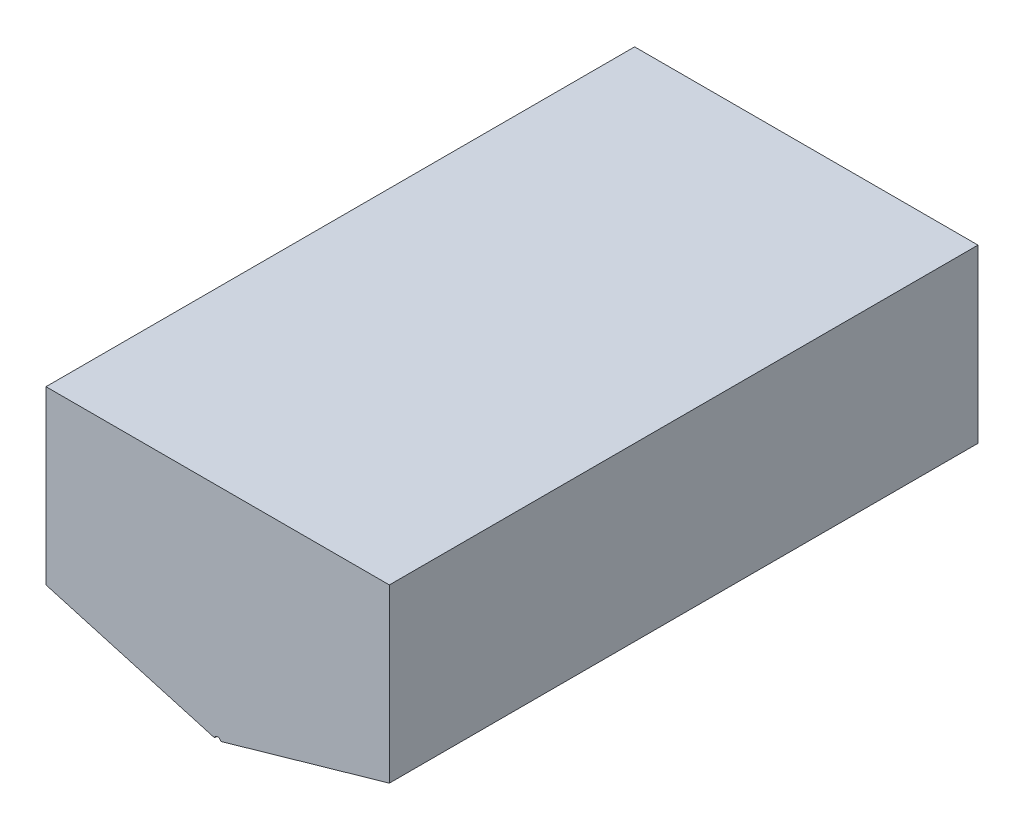
ISO-10303-21;
HEADER;
FILE_DESCRIPTION(('STEP AP214'),'2;1');
FILE_NAME('part.step','',(''),(''),'','','');
FILE_SCHEMA(('AUTOMOTIVE_DESIGN { 1 0 10303 214 1 1 1 1 }'));
ENDSEC;
DATA;
#1=APPLICATION_CONTEXT('core data for automotive mechanical design processes');
#2=APPLICATION_PROTOCOL_DEFINITION('international standard','automotive_design',2000,#1);
#3=PRODUCT_CONTEXT('',#1,'mechanical');
#4=PRODUCT('Part','Part','',(#3));
#5=PRODUCT_RELATED_PRODUCT_CATEGORY('part','',(#4));
#6=PRODUCT_DEFINITION_FORMATION('','',#4);
#7=PRODUCT_DEFINITION_CONTEXT('part definition',#1,'design');
#8=PRODUCT_DEFINITION('design','',#6,#7);
#9=PRODUCT_DEFINITION_SHAPE('','',#8);
#10=(LENGTH_UNIT() NAMED_UNIT(*) SI_UNIT(.MILLI.,.METRE.));
#11=(NAMED_UNIT(*) PLANE_ANGLE_UNIT() SI_UNIT($,.RADIAN.));
#12=(NAMED_UNIT(*) SI_UNIT($,.STERADIAN.) SOLID_ANGLE_UNIT());
#13=UNCERTAINTY_MEASURE_WITH_UNIT(LENGTH_MEASURE(1.E-05),#10,'distance_accuracy_value','');
#14=(GEOMETRIC_REPRESENTATION_CONTEXT(3) GLOBAL_UNCERTAINTY_ASSIGNED_CONTEXT((#13)) GLOBAL_UNIT_ASSIGNED_CONTEXT((#10,
#11,#12)) REPRESENTATION_CONTEXT('',''));
#15=CARTESIAN_POINT('',(0.,0.,0.));
#16=DIRECTION('',(0.,0.,1.));
#17=DIRECTION('',(1.,0.,0.));
#18=AXIS2_PLACEMENT_3D('',#15,#16,#17);
#19=CARTESIAN_POINT('',(0.0240380986910127,-22.5068680281974,120.));
#20=DIRECTION('',(0.,0.,-1.));
#21=DIRECTION('',(-1.,0.,0.));
#22=AXIS2_PLACEMENT_3D('',#19,#20,#21);
#23=CYLINDRICAL_SURFACE('',#22,0.425);
#24=CARTESIAN_POINT('',(0.0240380986910127,-22.5068680281974,90.));
#25=DIRECTION('',(0.,0.,1.));
#26=DIRECTION('',(1.,0.,0.));
#27=AXIS2_PLACEMENT_3D('',#24,#25,#26);
#28=CIRCLE('',#27,0.425);
#29=CARTESIAN_POINT('',(-0.384609579056337,-22.390111548841,90.));
#30=VERTEX_POINT('',#29);
#31=CARTESIAN_POINT('',(0.428860009969014,-22.3774685685802,90.));
#32=VERTEX_POINT('',#31);
#33=EDGE_CURVE('E114',#30,#32,#28,.F.);
#34=ORIENTED_EDGE('',*,*,#33,.F.);
#35=DIRECTION('',(0.,0.,-1.));
#36=VECTOR('',#35,1.);
#37=CARTESIAN_POINT('',(-0.384609579056337,-22.390111548841,120.));
#38=LINE('',#37,#36);
#39=CARTESIAN_POINT('',(-0.384609579056337,-22.390111548841,0.));
#40=VERTEX_POINT('',#39);
#41=EDGE_CURVE('E162',#30,#40,#38,.T.);
#42=ORIENTED_EDGE('',*,*,#41,.T.);
#43=CARTESIAN_POINT('',(0.0240380986910127,-22.5068680281974,0.));
#44=DIRECTION('',(0.,0.,-1.));
#45=DIRECTION('',(1.,0.,0.));
#46=AXIS2_PLACEMENT_3D('',#43,#44,#45);
#47=CIRCLE('',#46,0.425);
#48=CARTESIAN_POINT('',(0.428860009969014,-22.3774685685802,0.));
#49=VERTEX_POINT('',#48);
#50=EDGE_CURVE('E146',#40,#49,#47,.T.);
#51=ORIENTED_EDGE('',*,*,#50,.T.);
#52=DIRECTION('',(0.,0.,-1.));
#53=VECTOR('',#52,1.);
#54=CARTESIAN_POINT('',(0.428860009969014,-22.3774685685802,120.));
#55=LINE('',#54,#53);
#56=EDGE_CURVE('E160',#32,#49,#55,.T.);
#57=ORIENTED_EDGE('',*,*,#56,.F.);
#58=EDGE_LOOP('',(#34,#42,#51,#57));
#59=FACE_BOUND('',#58,.T.);
#60=ADVANCED_FACE('F34',(#59),#23,.F.);
#61=CARTESIAN_POINT('',(-35.,-12.5,120.));
#62=DIRECTION('',(1.,0.,0.));
#63=DIRECTION('',(0.,0.,-1.));
#64=AXIS2_PLACEMENT_3D('',#61,#62,#63);
#65=PLANE('',#64);
#66=DIRECTION('',(0.,-1.,0.));
#67=VECTOR('',#66,1.);
#68=CARTESIAN_POINT('',(-35.,-12.5,0.));
#69=LINE('',#68,#67);
#70=CARTESIAN_POINT('',(-35.,22.5,0.));
#71=VERTEX_POINT('',#70);
#72=CARTESIAN_POINT('',(-35.,-12.5,0.));
#73=VERTEX_POINT('',#72);
#74=EDGE_CURVE('E132',#71,#73,#69,.T.);
#75=ORIENTED_EDGE('',*,*,#74,.T.);
#76=DIRECTION('',(0.,0.,-1.));
#77=VECTOR('',#76,1.);
#78=CARTESIAN_POINT('',(-35.,-12.5,120.));
#79=LINE('',#78,#77);
#80=CARTESIAN_POINT('',(-35.,-12.5,120.));
#81=VERTEX_POINT('',#80);
#82=EDGE_CURVE('E42',#81,#73,#79,.T.);
#83=ORIENTED_EDGE('',*,*,#82,.F.);
#84=DIRECTION('',(0.,-1.,0.));
#85=VECTOR('',#84,1.);
#86=CARTESIAN_POINT('',(-35.,-12.5,120.));
#87=LINE('',#86,#85);
#88=CARTESIAN_POINT('',(-35.,22.5,120.));
#89=VERTEX_POINT('',#88);
#90=EDGE_CURVE('E133',#89,#81,#87,.T.);
#91=ORIENTED_EDGE('',*,*,#90,.F.);
#92=DIRECTION('',(0.,0.,-1.));
#93=VECTOR('',#92,1.);
#94=CARTESIAN_POINT('',(-35.,22.5,120.));
#95=LINE('',#94,#93);
#96=EDGE_CURVE('E140',#89,#71,#95,.T.);
#97=ORIENTED_EDGE('',*,*,#96,.T.);
#98=EDGE_LOOP('',(#75,#83,#91,#97));
#99=FACE_BOUND('',#98,.T.);
#100=ADVANCED_FACE('F36',(#99),#65,.F.);
#101=CARTESIAN_POINT('',(-0.384609579056337,-22.390111548841,120.));
#102=DIRECTION('',(0.274721127897378,0.961523947640823,0.));
#103=DIRECTION('',(-0.961523947640823,0.274721127897378,0.));
#104=AXIS2_PLACEMENT_3D('',#101,#102,#103);
#105=PLANE('',#104);
#106=DIRECTION('',(0.961523947640823,-0.274721127897378,0.));
#107=VECTOR('',#106,1.);
#108=CARTESIAN_POINT('',(-0.384609579056337,-22.390111548841,90.));
#109=LINE('',#108,#107);
#110=CARTESIAN_POINT('',(-0.649028664657562,-22.3145632386693,90.));
#111=VERTEX_POINT('',#110);
#112=EDGE_CURVE('E130',#111,#30,#109,.T.);
#113=ORIENTED_EDGE('',*,*,#112,.F.);
#114=DIRECTION('',(0.,0.,1.));
#115=VECTOR('',#114,1.);
#116=CARTESIAN_POINT('',(-0.649028664657562,-22.3145632386693,90.));
#117=LINE('',#116,#115);
#118=CARTESIAN_POINT('',(-0.649028664657563,-22.3145632386693,120.));
#119=VERTEX_POINT('',#118);
#120=EDGE_CURVE('E118',#111,#119,#117,.T.);
#121=ORIENTED_EDGE('',*,*,#120,.T.);
#122=DIRECTION('',(0.961523947640823,-0.274721127897378,0.));
#123=VECTOR('',#122,1.);
#124=CARTESIAN_POINT('',(-0.384609579056337,-22.390111548841,120.));
#125=LINE('',#124,#123);
#126=EDGE_CURVE('E93',#81,#119,#125,.T.);
#127=ORIENTED_EDGE('',*,*,#126,.F.);
#128=ORIENTED_EDGE('',*,*,#82,.T.);
#129=DIRECTION('',(0.961523947640823,-0.274721127897378,0.));
#130=VECTOR('',#129,1.);
#131=CARTESIAN_POINT('',(-0.384609579056337,-22.390111548841,0.));
#132=LINE('',#131,#130);
#133=EDGE_CURVE('E143',#73,#40,#132,.T.);
#134=ORIENTED_EDGE('',*,*,#133,.T.);
#135=ORIENTED_EDGE('',*,*,#41,.F.);
#136=EDGE_LOOP('',(#113,#121,#127,#128,#134,#135));
#137=FACE_BOUND('',#136,.T.);
#138=ADVANCED_FACE('F164',(#137),#105,.F.);
#139=CARTESIAN_POINT('',(0.428860009969014,-22.3774685685802,120.));
#140=DIRECTION('',(-0.274721127897377,0.961523947640824,0.));
#141=DIRECTION('',(-0.961523947640824,-0.274721127897377,0.));
#142=AXIS2_PLACEMENT_3D('',#139,#140,#141);
#143=PLANE('',#142);
#144=DIRECTION('',(0.961523947640824,0.274721127897377,0.));
#145=VECTOR('',#144,1.);
#146=CARTESIAN_POINT('',(0.428860009969014,-22.3774685685802,120.));
#147=LINE('',#146,#145);
#148=CARTESIAN_POINT('',(0.649028664657533,-22.3145632386692,120.));
#149=VERTEX_POINT('',#148);
#150=CARTESIAN_POINT('',(35.,-12.5,120.));
#151=VERTEX_POINT('',#150);
#152=EDGE_CURVE('E124',#149,#151,#147,.T.);
#153=ORIENTED_EDGE('',*,*,#152,.F.);
#154=DIRECTION('',(0.,0.,1.));
#155=VECTOR('',#154,1.);
#156=CARTESIAN_POINT('',(0.649028664657533,-22.3145632386692,90.));
#157=LINE('',#156,#155);
#158=CARTESIAN_POINT('',(0.649028664657533,-22.3145632386692,90.));
#159=VERTEX_POINT('',#158);
#160=EDGE_CURVE('E49',#149,#159,#157,.F.);
#161=ORIENTED_EDGE('',*,*,#160,.T.);
#162=DIRECTION('',(0.961523947640824,0.274721127897377,0.));
#163=VECTOR('',#162,1.);
#164=CARTESIAN_POINT('',(0.428860009969014,-22.3774685685802,90.));
#165=LINE('',#164,#163);
#166=EDGE_CURVE('E11',#32,#159,#165,.T.);
#167=ORIENTED_EDGE('',*,*,#166,.F.);
#168=ORIENTED_EDGE('',*,*,#56,.T.);
#169=DIRECTION('',(0.961523947640824,0.274721127897377,0.));
#170=VECTOR('',#169,1.);
#171=CARTESIAN_POINT('',(0.428860009969014,-22.3774685685802,0.));
#172=LINE('',#171,#170);
#173=CARTESIAN_POINT('',(35.,-12.5,0.));
#174=VERTEX_POINT('',#173);
#175=EDGE_CURVE('E149',#49,#174,#172,.T.);
#176=ORIENTED_EDGE('',*,*,#175,.T.);
#177=DIRECTION('',(0.,0.,-1.));
#178=VECTOR('',#177,1.);
#179=CARTESIAN_POINT('',(35.,-12.5,120.));
#180=LINE('',#179,#178);
#181=EDGE_CURVE('E157',#151,#174,#180,.T.);
#182=ORIENTED_EDGE('',*,*,#181,.F.);
#183=EDGE_LOOP('',(#153,#161,#167,#168,#176,#182));
#184=FACE_BOUND('',#183,.T.);
#185=ADVANCED_FACE('F122',(#184),#143,.F.);
#186=CARTESIAN_POINT('',(35.,-12.5,120.));
#187=DIRECTION('',(-1.,0.,0.));
#188=DIRECTION('',(0.,0.,1.));
#189=AXIS2_PLACEMENT_3D('',#186,#187,#188);
#190=PLANE('',#189);
#191=DIRECTION('',(0.,1.,0.));
#192=VECTOR('',#191,1.);
#193=CARTESIAN_POINT('',(35.,-12.5,0.));
#194=LINE('',#193,#192);
#195=CARTESIAN_POINT('',(35.,22.5,0.));
#196=VERTEX_POINT('',#195);
#197=EDGE_CURVE('E151',#174,#196,#194,.T.);
#198=ORIENTED_EDGE('',*,*,#197,.T.);
#199=DIRECTION('',(0.,0.,-1.));
#200=VECTOR('',#199,1.);
#201=CARTESIAN_POINT('',(35.,22.5,120.));
#202=LINE('',#201,#200);
#203=CARTESIAN_POINT('',(35.,22.5,120.));
#204=VERTEX_POINT('',#203);
#205=EDGE_CURVE('E155',#204,#196,#202,.T.);
#206=ORIENTED_EDGE('',*,*,#205,.F.);
#207=DIRECTION('',(0.,1.,0.));
#208=VECTOR('',#207,1.);
#209=CARTESIAN_POINT('',(35.,-12.5,120.));
#210=LINE('',#209,#208);
#211=EDGE_CURVE('E137',#151,#204,#210,.T.);
#212=ORIENTED_EDGE('',*,*,#211,.F.);
#213=ORIENTED_EDGE('',*,*,#181,.T.);
#214=EDGE_LOOP('',(#198,#206,#212,#213));
#215=FACE_BOUND('',#214,.T.);
#216=ADVANCED_FACE('F179',(#215),#190,.F.);
#217=CARTESIAN_POINT('',(35.,22.5,120.));
#218=DIRECTION('',(0.,-1.,0.));
#219=DIRECTION('',(1.,0.,0.));
#220=AXIS2_PLACEMENT_3D('',#217,#218,#219);
#221=PLANE('',#220);
#222=DIRECTION('',(-1.,0.,0.));
#223=VECTOR('',#222,1.);
#224=CARTESIAN_POINT('',(35.,22.5,0.));
#225=LINE('',#224,#223);
#226=EDGE_CURVE('E85',#196,#71,#225,.T.);
#227=ORIENTED_EDGE('',*,*,#226,.T.);
#228=ORIENTED_EDGE('',*,*,#96,.F.);
#229=DIRECTION('',(-1.,0.,0.));
#230=VECTOR('',#229,1.);
#231=CARTESIAN_POINT('',(35.,22.5,120.));
#232=LINE('',#231,#230);
#233=EDGE_CURVE('E58',#204,#89,#232,.T.);
#234=ORIENTED_EDGE('',*,*,#233,.F.);
#235=ORIENTED_EDGE('',*,*,#205,.T.);
#236=EDGE_LOOP('',(#227,#228,#234,#235));
#237=FACE_BOUND('',#236,.T.);
#238=ADVANCED_FACE('F180',(#237),#221,.F.);
#239=CARTESIAN_POINT('',(0.0240380986910127,-22.5068680281974,120.));
#240=DIRECTION('',(0.,0.,1.));
#241=DIRECTION('',(1.,0.,0.));
#242=AXIS2_PLACEMENT_3D('',#239,#240,#241);
#243=PLANE('',#242);
#244=CARTESIAN_POINT('',(0.,-22.5,120.));
#245=DIRECTION('',(0.,0.,1.));
#246=DIRECTION('',(1.,0.,0.));
#247=AXIS2_PLACEMENT_3D('',#244,#245,#246);
#248=CIRCLE('',#247,0.675);
#249=EDGE_CURVE('E119',#149,#119,#248,.T.);
#250=ORIENTED_EDGE('',*,*,#249,.F.);
#251=ORIENTED_EDGE('',*,*,#152,.T.);
#252=ORIENTED_EDGE('',*,*,#211,.T.);
#253=ORIENTED_EDGE('',*,*,#233,.T.);
#254=ORIENTED_EDGE('',*,*,#90,.T.);
#255=ORIENTED_EDGE('',*,*,#126,.T.);
#256=EDGE_LOOP('',(#250,#251,#252,#253,#254,#255));
#257=FACE_BOUND('',#256,.T.);
#258=ADVANCED_FACE('F175',(#257),#243,.T.);
#259=CARTESIAN_POINT('',(0.0240380986910127,-22.5068680281974,0.));
#260=DIRECTION('',(0.,0.,1.));
#261=DIRECTION('',(1.,0.,0.));
#262=AXIS2_PLACEMENT_3D('',#259,#260,#261);
#263=PLANE('',#262);
#264=ORIENTED_EDGE('',*,*,#74,.F.);
#265=ORIENTED_EDGE('',*,*,#226,.F.);
#266=ORIENTED_EDGE('',*,*,#197,.F.);
#267=ORIENTED_EDGE('',*,*,#175,.F.);
#268=ORIENTED_EDGE('',*,*,#50,.F.);
#269=ORIENTED_EDGE('',*,*,#133,.F.);
#270=EDGE_LOOP('',(#264,#265,#266,#267,#268,#269));
#271=FACE_BOUND('',#270,.T.);
#272=ADVANCED_FACE('F171',(#271),#263,.F.);
#273=CARTESIAN_POINT('',(0.,-22.5,90.));
#274=DIRECTION('',(0.,0.,1.));
#275=DIRECTION('',(1.,0.,0.));
#276=AXIS2_PLACEMENT_3D('',#273,#274,#275);
#277=PLANE('',#276);
#278=ORIENTED_EDGE('',*,*,#112,.T.);
#279=ORIENTED_EDGE('',*,*,#33,.T.);
#280=ORIENTED_EDGE('',*,*,#166,.T.);
#281=CARTESIAN_POINT('',(0.,-22.5,90.));
#282=DIRECTION('',(0.,0.,1.));
#283=DIRECTION('',(1.,0.,0.));
#284=AXIS2_PLACEMENT_3D('',#281,#282,#283);
#285=CIRCLE('',#284,0.675);
#286=EDGE_CURVE('E111',#159,#111,#285,.T.);
#287=ORIENTED_EDGE('',*,*,#286,.T.);
#288=EDGE_LOOP('',(#278,#279,#280,#287));
#289=FACE_BOUND('',#288,.T.);
#290=ADVANCED_FACE('F110',(#289),#277,.T.);
#291=CARTESIAN_POINT('',(0.,-22.5,90.));
#292=DIRECTION('',(0.,0.,1.));
#293=DIRECTION('',(1.,0.,0.));
#294=AXIS2_PLACEMENT_3D('',#291,#292,#293);
#295=CYLINDRICAL_SURFACE('',#294,0.675);
#296=ORIENTED_EDGE('',*,*,#286,.F.);
#297=ORIENTED_EDGE('',*,*,#160,.F.);
#298=ORIENTED_EDGE('',*,*,#249,.T.);
#299=ORIENTED_EDGE('',*,*,#120,.F.);
#300=EDGE_LOOP('',(#296,#297,#298,#299));
#301=FACE_BOUND('',#300,.T.);
#302=ADVANCED_FACE('F117',(#301),#295,.F.);
#303=CLOSED_SHELL('',(#60,#100,#138,#185,#216,#238,#258,#272,#290,#302));
#304=MANIFOLD_SOLID_BREP('B2',#303);
#305=ADVANCED_BREP_SHAPE_REPRESENTATION('',(#18,#304),#14);
#306=SHAPE_DEFINITION_REPRESENTATION(#9,#305);
ENDSEC;
END-ISO-10303-21;
